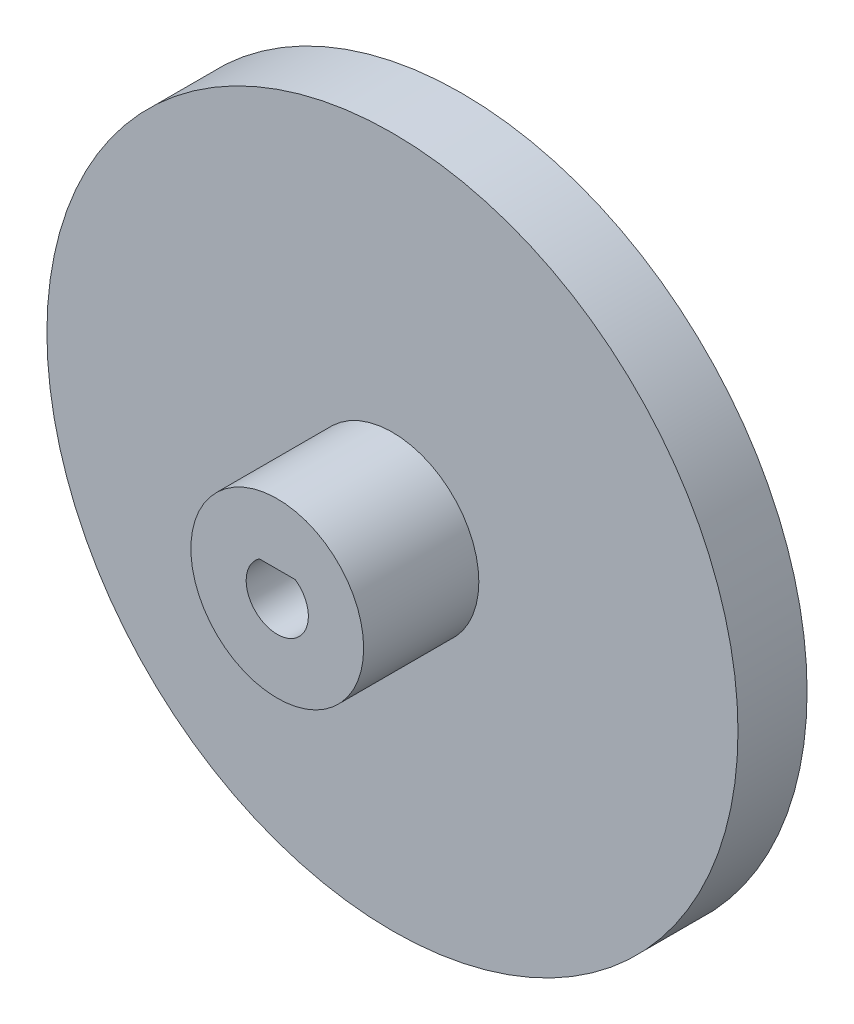
ISO-10303-21;
HEADER;
FILE_DESCRIPTION(('STEP AP214'),'2;1');
FILE_NAME('part.step','',(''),(''),'','','');
FILE_SCHEMA(('AUTOMOTIVE_DESIGN { 1 0 10303 214 1 1 1 1 }'));
ENDSEC;
DATA;
#1=APPLICATION_CONTEXT('core data for automotive mechanical design processes');
#2=APPLICATION_PROTOCOL_DEFINITION('international standard','automotive_design',2000,#1);
#3=PRODUCT_CONTEXT('',#1,'mechanical');
#4=PRODUCT('Part','Part','',(#3));
#5=PRODUCT_RELATED_PRODUCT_CATEGORY('part','',(#4));
#6=PRODUCT_DEFINITION_FORMATION('','',#4);
#7=PRODUCT_DEFINITION_CONTEXT('part definition',#1,'design');
#8=PRODUCT_DEFINITION('design','',#6,#7);
#9=PRODUCT_DEFINITION_SHAPE('','',#8);
#10=(LENGTH_UNIT() NAMED_UNIT(*) SI_UNIT(.MILLI.,.METRE.));
#11=(NAMED_UNIT(*) PLANE_ANGLE_UNIT() SI_UNIT($,.RADIAN.));
#12=(NAMED_UNIT(*) SI_UNIT($,.STERADIAN.) SOLID_ANGLE_UNIT());
#13=UNCERTAINTY_MEASURE_WITH_UNIT(LENGTH_MEASURE(1.E-05),#10,'distance_accuracy_value','');
#14=(GEOMETRIC_REPRESENTATION_CONTEXT(3) GLOBAL_UNCERTAINTY_ASSIGNED_CONTEXT((#13)) GLOBAL_UNIT_ASSIGNED_CONTEXT((#10,
#11,#12)) REPRESENTATION_CONTEXT('',''));
#15=CARTESIAN_POINT('',(0.,0.,0.));
#16=DIRECTION('',(0.,0.,1.));
#17=DIRECTION('',(1.,0.,0.));
#18=AXIS2_PLACEMENT_3D('',#15,#16,#17);
#19=CARTESIAN_POINT('',(0.,0.,-10.));
#20=DIRECTION('',(0.,0.,1.));
#21=DIRECTION('',(1.,0.,0.));
#22=AXIS2_PLACEMENT_3D('',#19,#20,#21);
#23=CYLINDRICAL_SURFACE('',#22,2.7);
#24=DIRECTION('',(0.,0.,1.));
#25=VECTOR('',#24,1.);
#26=CARTESIAN_POINT('',(-1.56524758424985,2.2,-10.));
#27=LINE('',#26,#25);
#28=CARTESIAN_POINT('',(-1.56524758424985,2.2,-10.));
#29=VERTEX_POINT('',#28);
#30=CARTESIAN_POINT('',(-1.56524758424985,2.2,3.));
#31=VERTEX_POINT('',#30);
#32=EDGE_CURVE('E37',#29,#31,#27,.T.);
#33=ORIENTED_EDGE('',*,*,#32,.T.);
#34=CARTESIAN_POINT('',(0.,0.,3.));
#35=DIRECTION('',(0.,0.,1.));
#36=DIRECTION('',(1.,0.,0.));
#37=AXIS2_PLACEMENT_3D('',#34,#35,#36);
#38=CIRCLE('',#37,2.7);
#39=CARTESIAN_POINT('',(1.56524758424985,2.2,3.));
#40=VERTEX_POINT('',#39);
#41=EDGE_CURVE('E129',#40,#31,#38,.F.);
#42=ORIENTED_EDGE('',*,*,#41,.F.);
#43=DIRECTION('',(0.,0.,1.));
#44=VECTOR('',#43,1.);
#45=CARTESIAN_POINT('',(1.56524758424985,2.2,-10.));
#46=LINE('',#45,#44);
#47=CARTESIAN_POINT('',(1.56524758424985,2.2,-10.));
#48=VERTEX_POINT('',#47);
#49=EDGE_CURVE('E42',#48,#40,#46,.T.);
#50=ORIENTED_EDGE('',*,*,#49,.F.);
#51=CARTESIAN_POINT('',(0.,0.,-10.));
#52=DIRECTION('',(0.,0.,1.));
#53=DIRECTION('',(1.,0.,0.));
#54=AXIS2_PLACEMENT_3D('',#51,#52,#53);
#55=CIRCLE('',#54,2.7);
#56=EDGE_CURVE('E162',#29,#48,#55,.T.);
#57=ORIENTED_EDGE('',*,*,#56,.F.);
#58=EDGE_LOOP('',(#33,#42,#50,#57));
#59=FACE_BOUND('',#58,.T.);
#60=ADVANCED_FACE('F34',(#59),#23,.F.);
#61=CARTESIAN_POINT('',(0.,2.2,-10.));
#62=DIRECTION('',(0.,1.,0.));
#63=DIRECTION('',(0.,0.,1.));
#64=AXIS2_PLACEMENT_3D('',#61,#62,#63);
#65=PLANE('',#64);
#66=ORIENTED_EDGE('',*,*,#49,.T.);
#67=DIRECTION('',(1.,0.,0.));
#68=VECTOR('',#67,1.);
#69=CARTESIAN_POINT('',(0.,2.2,3.));
#70=LINE('',#69,#68);
#71=EDGE_CURVE('E132',#31,#40,#70,.T.);
#72=ORIENTED_EDGE('',*,*,#71,.F.);
#73=ORIENTED_EDGE('',*,*,#32,.F.);
#74=DIRECTION('',(-1.,0.,0.));
#75=VECTOR('',#74,1.);
#76=CARTESIAN_POINT('',(0.,2.2,-10.));
#77=LINE('',#76,#75);
#78=EDGE_CURVE('E58',#48,#29,#77,.T.);
#79=ORIENTED_EDGE('',*,*,#78,.F.);
#80=EDGE_LOOP('',(#66,#72,#73,#79));
#81=FACE_BOUND('',#80,.T.);
#82=ADVANCED_FACE('F173',(#81),#65,.F.);
#83=CARTESIAN_POINT('',(0.,0.,-10.));
#84=DIRECTION('',(0.,0.,1.));
#85=DIRECTION('',(1.,0.,0.));
#86=AXIS2_PLACEMENT_3D('',#83,#84,#85);
#87=CYLINDRICAL_SURFACE('',#86,7.5);
#88=CARTESIAN_POINT('',(0.,0.,-10.));
#89=DIRECTION('',(0.,0.,1.));
#90=DIRECTION('',(1.,0.,0.));
#91=AXIS2_PLACEMENT_3D('',#88,#89,#90);
#92=CIRCLE('',#91,7.5);
#93=CARTESIAN_POINT('',(7.5,0.,-10.));
#94=VERTEX_POINT('',#93);
#95=EDGE_CURVE('E165',#94,#94,#92,.T.);
#96=ORIENTED_EDGE('',*,*,#95,.T.);
#97=EDGE_LOOP('',(#96));
#98=FACE_BOUND('',#97,.T.);
#99=CARTESIAN_POINT('',(0.,0.,0.));
#100=DIRECTION('',(0.,0.,1.));
#101=DIRECTION('',(1.,0.,0.));
#102=AXIS2_PLACEMENT_3D('',#99,#100,#101);
#103=CIRCLE('',#102,7.5);
#104=CARTESIAN_POINT('',(7.5,0.,0.));
#105=VERTEX_POINT('',#104);
#106=EDGE_CURVE('E136',#105,#105,#103,.T.);
#107=ORIENTED_EDGE('',*,*,#106,.F.);
#108=EDGE_LOOP('',(#107));
#109=FACE_BOUND('',#108,.T.);
#110=ADVANCED_FACE('F198',(#98,#109),#87,.T.);
#111=CARTESIAN_POINT('',(0.,0.,-10.));
#112=DIRECTION('',(0.,0.,1.));
#113=DIRECTION('',(1.,0.,0.));
#114=AXIS2_PLACEMENT_3D('',#111,#112,#113);
#115=PLANE('',#114);
#116=ORIENTED_EDGE('',*,*,#56,.T.);
#117=ORIENTED_EDGE('',*,*,#78,.T.);
#118=EDGE_LOOP('',(#116,#117));
#119=FACE_BOUND('',#118,.T.);
#120=ORIENTED_EDGE('',*,*,#95,.F.);
#121=EDGE_LOOP('',(#120));
#122=FACE_BOUND('',#121,.T.);
#123=ADVANCED_FACE('F202',(#119,#122),#115,.F.);
#124=CARTESIAN_POINT('',(0.,0.,3.));
#125=DIRECTION('',(0.,0.,-1.));
#126=DIRECTION('',(-1.,0.,0.));
#127=AXIS2_PLACEMENT_3D('',#124,#125,#126);
#128=CYLINDRICAL_SURFACE('',#127,30.);
#129=CARTESIAN_POINT('',(0.,0.,0.));
#130=DIRECTION('',(0.,0.,1.));
#131=DIRECTION('',(1.,0.,0.));
#132=AXIS2_PLACEMENT_3D('',#129,#130,#131);
#133=CIRCLE('',#132,30.);
#134=CARTESIAN_POINT('',(30.,0.,0.));
#135=VERTEX_POINT('',#134);
#136=EDGE_CURVE('E133',#135,#135,#133,.T.);
#137=ORIENTED_EDGE('',*,*,#136,.T.);
#138=EDGE_LOOP('',(#137));
#139=FACE_BOUND('',#138,.T.);
#140=CARTESIAN_POINT('',(0.,0.,6.));
#141=DIRECTION('',(0.,0.,1.));
#142=DIRECTION('',(1.,0.,0.));
#143=AXIS2_PLACEMENT_3D('',#140,#141,#142);
#144=CIRCLE('',#143,30.);
#145=CARTESIAN_POINT('',(30.,0.,6.));
#146=VERTEX_POINT('',#145);
#147=EDGE_CURVE('E84',#146,#146,#144,.T.);
#148=ORIENTED_EDGE('',*,*,#147,.F.);
#149=EDGE_LOOP('',(#148));
#150=FACE_BOUND('',#149,.T.);
#151=ADVANCED_FACE('F208',(#139,#150),#128,.T.);
#152=CARTESIAN_POINT('',(16.9705627484771,16.9705627484771,3.));
#153=DIRECTION('',(0.,0.,-1.));
#154=DIRECTION('',(-1.,0.,0.));
#155=AXIS2_PLACEMENT_3D('',#152,#153,#154);
#156=CYLINDRICAL_SURFACE('',#155,4.25);
#157=CARTESIAN_POINT('',(16.9705627484771,16.9705627484771,3.));
#158=DIRECTION('',(0.,0.,1.));
#159=DIRECTION('',(1.,0.,0.));
#160=AXIS2_PLACEMENT_3D('',#157,#158,#159);
#161=CIRCLE('',#160,4.25);
#162=CARTESIAN_POINT('',(21.2205627484771,16.9705627484771,3.));
#163=VERTEX_POINT('',#162);
#164=EDGE_CURVE('E104',#163,#163,#161,.T.);
#165=ORIENTED_EDGE('',*,*,#164,.T.);
#166=EDGE_LOOP('',(#165));
#167=FACE_BOUND('',#166,.T.);
#168=CARTESIAN_POINT('',(16.9705627484771,16.9705627484771,0.));
#169=DIRECTION('',(0.,0.,1.));
#170=DIRECTION('',(1.,0.,0.));
#171=AXIS2_PLACEMENT_3D('',#168,#169,#170);
#172=CIRCLE('',#171,4.25);
#173=CARTESIAN_POINT('',(21.2205627484771,16.9705627484771,0.));
#174=VERTEX_POINT('',#173);
#175=EDGE_CURVE('E157',#174,#174,#172,.T.);
#176=ORIENTED_EDGE('',*,*,#175,.F.);
#177=EDGE_LOOP('',(#176));
#178=FACE_BOUND('',#177,.T.);
#179=ADVANCED_FACE('F236',(#167,#178),#156,.F.);
#180=CARTESIAN_POINT('',(24.,0.,3.));
#181=DIRECTION('',(0.,0.,-1.));
#182=DIRECTION('',(-1.,0.,0.));
#183=AXIS2_PLACEMENT_3D('',#180,#181,#182);
#184=CYLINDRICAL_SURFACE('',#183,4.25);
#185=CARTESIAN_POINT('',(24.,0.,3.));
#186=DIRECTION('',(0.,0.,1.));
#187=DIRECTION('',(1.,0.,0.));
#188=AXIS2_PLACEMENT_3D('',#185,#186,#187);
#189=CIRCLE('',#188,4.25);
#190=CARTESIAN_POINT('',(28.25,0.,3.));
#191=VERTEX_POINT('',#190);
#192=EDGE_CURVE('E124',#191,#191,#189,.T.);
#193=ORIENTED_EDGE('',*,*,#192,.T.);
#194=EDGE_LOOP('',(#193));
#195=FACE_BOUND('',#194,.T.);
#196=CARTESIAN_POINT('',(24.,0.,0.));
#197=DIRECTION('',(0.,0.,1.));
#198=DIRECTION('',(1.,0.,0.));
#199=AXIS2_PLACEMENT_3D('',#196,#197,#198);
#200=CIRCLE('',#199,4.25);
#201=CARTESIAN_POINT('',(28.25,0.,0.));
#202=VERTEX_POINT('',#201);
#203=EDGE_CURVE('E154',#202,#202,#200,.T.);
#204=ORIENTED_EDGE('',*,*,#203,.F.);
#205=EDGE_LOOP('',(#204));
#206=FACE_BOUND('',#205,.T.);
#207=ADVANCED_FACE('F232',(#195,#206),#184,.F.);
#208=CARTESIAN_POINT('',(16.9705627484771,-16.9705627484771,3.));
#209=DIRECTION('',(0.,0.,-1.));
#210=DIRECTION('',(-1.,0.,0.));
#211=AXIS2_PLACEMENT_3D('',#208,#209,#210);
#212=CYLINDRICAL_SURFACE('',#211,4.25);
#213=CARTESIAN_POINT('',(16.9705627484771,-16.9705627484771,3.));
#214=DIRECTION('',(0.,0.,1.));
#215=DIRECTION('',(1.,0.,0.));
#216=AXIS2_PLACEMENT_3D('',#213,#214,#215);
#217=CIRCLE('',#216,4.25);
#218=CARTESIAN_POINT('',(21.2205627484771,-16.9705627484771,3.));
#219=VERTEX_POINT('',#218);
#220=EDGE_CURVE('E121',#219,#219,#217,.T.);
#221=ORIENTED_EDGE('',*,*,#220,.T.);
#222=EDGE_LOOP('',(#221));
#223=FACE_BOUND('',#222,.T.);
#224=CARTESIAN_POINT('',(16.9705627484771,-16.9705627484771,0.));
#225=DIRECTION('',(0.,0.,1.));
#226=DIRECTION('',(1.,0.,0.));
#227=AXIS2_PLACEMENT_3D('',#224,#225,#226);
#228=CIRCLE('',#227,4.25);
#229=CARTESIAN_POINT('',(21.2205627484771,-16.9705627484771,0.));
#230=VERTEX_POINT('',#229);
#231=EDGE_CURVE('E151',#230,#230,#228,.T.);
#232=ORIENTED_EDGE('',*,*,#231,.F.);
#233=EDGE_LOOP('',(#232));
#234=FACE_BOUND('',#233,.T.);
#235=ADVANCED_FACE('F228',(#223,#234),#212,.F.);
#236=CARTESIAN_POINT('',(0.,-24.,3.));
#237=DIRECTION('',(0.,0.,-1.));
#238=DIRECTION('',(-1.,0.,0.));
#239=AXIS2_PLACEMENT_3D('',#236,#237,#238);
#240=CYLINDRICAL_SURFACE('',#239,4.25);
#241=CARTESIAN_POINT('',(0.,-24.,3.));
#242=DIRECTION('',(0.,0.,1.));
#243=DIRECTION('',(1.,0.,0.));
#244=AXIS2_PLACEMENT_3D('',#241,#242,#243);
#245=CIRCLE('',#244,4.25);
#246=CARTESIAN_POINT('',(4.25,-24.,3.));
#247=VERTEX_POINT('',#246);
#248=EDGE_CURVE('E118',#247,#247,#245,.T.);
#249=ORIENTED_EDGE('',*,*,#248,.T.);
#250=EDGE_LOOP('',(#249));
#251=FACE_BOUND('',#250,.T.);
#252=CARTESIAN_POINT('',(0.,-24.,0.));
#253=DIRECTION('',(0.,0.,1.));
#254=DIRECTION('',(1.,0.,0.));
#255=AXIS2_PLACEMENT_3D('',#252,#253,#254);
#256=CIRCLE('',#255,4.25);
#257=CARTESIAN_POINT('',(4.25,-24.,0.));
#258=VERTEX_POINT('',#257);
#259=EDGE_CURVE('E148',#258,#258,#256,.T.);
#260=ORIENTED_EDGE('',*,*,#259,.F.);
#261=EDGE_LOOP('',(#260));
#262=FACE_BOUND('',#261,.T.);
#263=ADVANCED_FACE('F224',(#251,#262),#240,.F.);
#264=CARTESIAN_POINT('',(-16.9705627484771,-16.9705627484771,3.));
#265=DIRECTION('',(0.,0.,-1.));
#266=DIRECTION('',(-1.,0.,0.));
#267=AXIS2_PLACEMENT_3D('',#264,#265,#266);
#268=CYLINDRICAL_SURFACE('',#267,4.25);
#269=CARTESIAN_POINT('',(-16.9705627484771,-16.9705627484771,3.));
#270=DIRECTION('',(0.,0.,1.));
#271=DIRECTION('',(1.,0.,0.));
#272=AXIS2_PLACEMENT_3D('',#269,#270,#271);
#273=CIRCLE('',#272,4.25);
#274=CARTESIAN_POINT('',(-12.7205627484771,-16.9705627484771,3.));
#275=VERTEX_POINT('',#274);
#276=EDGE_CURVE('E115',#275,#275,#273,.T.);
#277=ORIENTED_EDGE('',*,*,#276,.T.);
#278=EDGE_LOOP('',(#277));
#279=FACE_BOUND('',#278,.T.);
#280=CARTESIAN_POINT('',(-16.9705627484771,-16.9705627484771,0.));
#281=DIRECTION('',(0.,0.,1.));
#282=DIRECTION('',(1.,0.,0.));
#283=AXIS2_PLACEMENT_3D('',#280,#281,#282);
#284=CIRCLE('',#283,4.25);
#285=CARTESIAN_POINT('',(-12.7205627484771,-16.9705627484771,0.));
#286=VERTEX_POINT('',#285);
#287=EDGE_CURVE('E145',#286,#286,#284,.T.);
#288=ORIENTED_EDGE('',*,*,#287,.F.);
#289=EDGE_LOOP('',(#288));
#290=FACE_BOUND('',#289,.T.);
#291=ADVANCED_FACE('F220',(#279,#290),#268,.F.);
#292=CARTESIAN_POINT('',(-24.,0.,3.));
#293=DIRECTION('',(0.,0.,-1.));
#294=DIRECTION('',(-1.,0.,0.));
#295=AXIS2_PLACEMENT_3D('',#292,#293,#294);
#296=CYLINDRICAL_SURFACE('',#295,4.25);
#297=CARTESIAN_POINT('',(-24.,0.,3.));
#298=DIRECTION('',(0.,0.,1.));
#299=DIRECTION('',(1.,0.,0.));
#300=AXIS2_PLACEMENT_3D('',#297,#298,#299);
#301=CIRCLE('',#300,4.25);
#302=CARTESIAN_POINT('',(-19.75,0.,3.));
#303=VERTEX_POINT('',#302);
#304=EDGE_CURVE('E112',#303,#303,#301,.T.);
#305=ORIENTED_EDGE('',*,*,#304,.T.);
#306=EDGE_LOOP('',(#305));
#307=FACE_BOUND('',#306,.T.);
#308=CARTESIAN_POINT('',(-24.,0.,0.));
#309=DIRECTION('',(0.,0.,1.));
#310=DIRECTION('',(1.,0.,0.));
#311=AXIS2_PLACEMENT_3D('',#308,#309,#310);
#312=CIRCLE('',#311,4.25);
#313=CARTESIAN_POINT('',(-19.75,0.,0.));
#314=VERTEX_POINT('',#313);
#315=EDGE_CURVE('E142',#314,#314,#312,.T.);
#316=ORIENTED_EDGE('',*,*,#315,.F.);
#317=EDGE_LOOP('',(#316));
#318=FACE_BOUND('',#317,.T.);
#319=ADVANCED_FACE('F216',(#307,#318),#296,.F.);
#320=CARTESIAN_POINT('',(-16.9705627484771,16.9705627484771,3.));
#321=DIRECTION('',(0.,0.,-1.));
#322=DIRECTION('',(-1.,0.,0.));
#323=AXIS2_PLACEMENT_3D('',#320,#321,#322);
#324=CYLINDRICAL_SURFACE('',#323,4.25);
#325=CARTESIAN_POINT('',(-16.9705627484771,16.9705627484771,3.));
#326=DIRECTION('',(0.,0.,1.));
#327=DIRECTION('',(1.,0.,0.));
#328=AXIS2_PLACEMENT_3D('',#325,#326,#327);
#329=CIRCLE('',#328,4.25);
#330=CARTESIAN_POINT('',(-12.7205627484771,16.9705627484771,3.));
#331=VERTEX_POINT('',#330);
#332=EDGE_CURVE('E109',#331,#331,#329,.T.);
#333=ORIENTED_EDGE('',*,*,#332,.T.);
#334=EDGE_LOOP('',(#333));
#335=FACE_BOUND('',#334,.T.);
#336=CARTESIAN_POINT('',(-16.9705627484771,16.9705627484771,0.));
#337=DIRECTION('',(0.,0.,1.));
#338=DIRECTION('',(1.,0.,0.));
#339=AXIS2_PLACEMENT_3D('',#336,#337,#338);
#340=CIRCLE('',#339,4.25);
#341=CARTESIAN_POINT('',(-12.7205627484771,16.9705627484771,0.));
#342=VERTEX_POINT('',#341);
#343=EDGE_CURVE('E139',#342,#342,#340,.T.);
#344=ORIENTED_EDGE('',*,*,#343,.F.);
#345=EDGE_LOOP('',(#344));
#346=FACE_BOUND('',#345,.T.);
#347=ADVANCED_FACE('F212',(#335,#346),#324,.F.);
#348=CARTESIAN_POINT('',(0.,24.,3.));
#349=DIRECTION('',(0.,0.,-1.));
#350=DIRECTION('',(-1.,0.,0.));
#351=AXIS2_PLACEMENT_3D('',#348,#349,#350);
#352=CYLINDRICAL_SURFACE('',#351,4.25);
#353=CARTESIAN_POINT('',(0.,24.,3.));
#354=DIRECTION('',(0.,0.,1.));
#355=DIRECTION('',(1.,0.,0.));
#356=AXIS2_PLACEMENT_3D('',#353,#354,#355);
#357=CIRCLE('',#356,4.25);
#358=CARTESIAN_POINT('',(4.25,24.,3.));
#359=VERTEX_POINT('',#358);
#360=EDGE_CURVE('E105',#359,#359,#357,.T.);
#361=ORIENTED_EDGE('',*,*,#360,.T.);
#362=EDGE_LOOP('',(#361));
#363=FACE_BOUND('',#362,.T.);
#364=CARTESIAN_POINT('',(0.,24.,0.));
#365=DIRECTION('',(0.,0.,1.));
#366=DIRECTION('',(1.,0.,0.));
#367=AXIS2_PLACEMENT_3D('',#364,#365,#366);
#368=CIRCLE('',#367,4.25);
#369=CARTESIAN_POINT('',(4.25,24.,0.));
#370=VERTEX_POINT('',#369);
#371=EDGE_CURVE('E108',#370,#370,#368,.T.);
#372=ORIENTED_EDGE('',*,*,#371,.F.);
#373=EDGE_LOOP('',(#372));
#374=FACE_BOUND('',#373,.T.);
#375=ADVANCED_FACE('F187',(#363,#374),#352,.F.);
#376=CARTESIAN_POINT('',(0.,0.,0.));
#377=DIRECTION('',(0.,0.,1.));
#378=DIRECTION('',(1.,0.,0.));
#379=AXIS2_PLACEMENT_3D('',#376,#377,#378);
#380=PLANE('',#379);
#381=ORIENTED_EDGE('',*,*,#106,.T.);
#382=EDGE_LOOP('',(#381));
#383=FACE_BOUND('',#382,.T.);
#384=ORIENTED_EDGE('',*,*,#371,.T.);
#385=EDGE_LOOP('',(#384));
#386=FACE_BOUND('',#385,.T.);
#387=ORIENTED_EDGE('',*,*,#343,.T.);
#388=EDGE_LOOP('',(#387));
#389=FACE_BOUND('',#388,.T.);
#390=ORIENTED_EDGE('',*,*,#315,.T.);
#391=EDGE_LOOP('',(#390));
#392=FACE_BOUND('',#391,.T.);
#393=ORIENTED_EDGE('',*,*,#287,.T.);
#394=EDGE_LOOP('',(#393));
#395=FACE_BOUND('',#394,.T.);
#396=ORIENTED_EDGE('',*,*,#259,.T.);
#397=EDGE_LOOP('',(#396));
#398=FACE_BOUND('',#397,.T.);
#399=ORIENTED_EDGE('',*,*,#231,.T.);
#400=EDGE_LOOP('',(#399));
#401=FACE_BOUND('',#400,.T.);
#402=ORIENTED_EDGE('',*,*,#203,.T.);
#403=EDGE_LOOP('',(#402));
#404=FACE_BOUND('',#403,.T.);
#405=ORIENTED_EDGE('',*,*,#175,.T.);
#406=EDGE_LOOP('',(#405));
#407=FACE_BOUND('',#406,.T.);
#408=ORIENTED_EDGE('',*,*,#136,.F.);
#409=EDGE_LOOP('',(#408));
#410=FACE_BOUND('',#409,.T.);
#411=ADVANCED_FACE('F178',(#383,#386,#389,#392,#395,#398,#401,#404,#407,#410),#380,.F.);
#412=CARTESIAN_POINT('',(0.,0.,3.));
#413=DIRECTION('',(0.,0.,1.));
#414=DIRECTION('',(1.,0.,0.));
#415=AXIS2_PLACEMENT_3D('',#412,#413,#414);
#416=PLANE('',#415);
#417=ORIENTED_EDGE('',*,*,#71,.T.);
#418=ORIENTED_EDGE('',*,*,#41,.T.);
#419=EDGE_LOOP('',(#417,#418));
#420=FACE_BOUND('',#419,.T.);
#421=ADVANCED_FACE('F175',(#420),#416,.F.);
#422=ORIENTED_EDGE('',*,*,#164,.F.);
#423=EDGE_LOOP('',(#422));
#424=FACE_BOUND('',#423,.T.);
#425=ADVANCED_FACE('F177',(#424),#416,.F.);
#426=ORIENTED_EDGE('',*,*,#192,.F.);
#427=EDGE_LOOP('',(#426));
#428=FACE_BOUND('',#427,.T.);
#429=ADVANCED_FACE('F180',(#428),#416,.F.);
#430=ORIENTED_EDGE('',*,*,#220,.F.);
#431=EDGE_LOOP('',(#430));
#432=FACE_BOUND('',#431,.T.);
#433=ADVANCED_FACE('F192',(#432),#416,.F.);
#434=ORIENTED_EDGE('',*,*,#248,.F.);
#435=EDGE_LOOP('',(#434));
#436=FACE_BOUND('',#435,.T.);
#437=ADVANCED_FACE('F334',(#436),#416,.F.);
#438=ORIENTED_EDGE('',*,*,#276,.F.);
#439=EDGE_LOOP('',(#438));
#440=FACE_BOUND('',#439,.T.);
#441=ADVANCED_FACE('F325',(#440),#416,.F.);
#442=ORIENTED_EDGE('',*,*,#304,.F.);
#443=EDGE_LOOP('',(#442));
#444=FACE_BOUND('',#443,.T.);
#445=ADVANCED_FACE('F316',(#444),#416,.F.);
#446=ORIENTED_EDGE('',*,*,#332,.F.);
#447=EDGE_LOOP('',(#446));
#448=FACE_BOUND('',#447,.T.);
#449=ADVANCED_FACE('F258',(#448),#416,.F.);
#450=ORIENTED_EDGE('',*,*,#360,.F.);
#451=EDGE_LOOP('',(#450));
#452=FACE_BOUND('',#451,.T.);
#453=ADVANCED_FACE('F186',(#452),#416,.F.);
#454=CARTESIAN_POINT('',(0.,0.,6.));
#455=DIRECTION('',(0.,0.,1.));
#456=DIRECTION('',(1.,0.,0.));
#457=AXIS2_PLACEMENT_3D('',#454,#455,#456);
#458=PLANE('',#457);
#459=CARTESIAN_POINT('',(0.,0.,6.));
#460=DIRECTION('',(0.,0.,1.));
#461=DIRECTION('',(1.,0.,0.));
#462=AXIS2_PLACEMENT_3D('',#459,#460,#461);
#463=CIRCLE('',#462,7.5);
#464=CARTESIAN_POINT('',(7.5,0.,6.));
#465=VERTEX_POINT('',#464);
#466=EDGE_CURVE('E11',#465,#465,#463,.T.);
#467=ORIENTED_EDGE('',*,*,#466,.F.);
#468=EDGE_LOOP('',(#467));
#469=FACE_BOUND('',#468,.T.);
#470=ORIENTED_EDGE('',*,*,#147,.T.);
#471=EDGE_LOOP('',(#470));
#472=FACE_BOUND('',#471,.T.);
#473=ADVANCED_FACE('F249',(#469,#472),#458,.T.);
#474=CARTESIAN_POINT('',(0.,0.,16.));
#475=DIRECTION('',(0.,0.,-1.));
#476=DIRECTION('',(-1.,0.,0.));
#477=AXIS2_PLACEMENT_3D('',#474,#475,#476);
#478=CYLINDRICAL_SURFACE('',#477,2.7);
#479=CARTESIAN_POINT('',(0.,0.,6.));
#480=DIRECTION('',(0.,0.,1.));
#481=DIRECTION('',(1.,0.,0.));
#482=AXIS2_PLACEMENT_3D('',#479,#480,#481);
#483=CIRCLE('',#482,2.7);
#484=CARTESIAN_POINT('',(-1.56524758424985,2.2,6.));
#485=VERTEX_POINT('',#484);
#486=CARTESIAN_POINT('',(1.56524758424985,2.2,6.));
#487=VERTEX_POINT('',#486);
#488=EDGE_CURVE('E50',#485,#487,#483,.T.);
#489=ORIENTED_EDGE('',*,*,#488,.F.);
#490=DIRECTION('',(0.,0.,-1.));
#491=VECTOR('',#490,1.);
#492=CARTESIAN_POINT('',(-1.56524758424985,2.2,16.));
#493=LINE('',#492,#491);
#494=CARTESIAN_POINT('',(-1.56524758424985,2.2,16.));
#495=VERTEX_POINT('',#494);
#496=EDGE_CURVE('E75',#495,#485,#493,.T.);
#497=ORIENTED_EDGE('',*,*,#496,.F.);
#498=CARTESIAN_POINT('',(0.,0.,16.));
#499=DIRECTION('',(0.,0.,1.));
#500=DIRECTION('',(1.,0.,0.));
#501=AXIS2_PLACEMENT_3D('',#498,#499,#500);
#502=CIRCLE('',#501,2.7);
#503=CARTESIAN_POINT('',(1.56524758424985,2.2,16.));
#504=VERTEX_POINT('',#503);
#505=EDGE_CURVE('E78',#495,#504,#502,.T.);
#506=ORIENTED_EDGE('',*,*,#505,.T.);
#507=DIRECTION('',(0.,0.,-1.));
#508=VECTOR('',#507,1.);
#509=CARTESIAN_POINT('',(1.56524758424985,2.2,16.));
#510=LINE('',#509,#508);
#511=EDGE_CURVE('E85',#504,#487,#510,.T.);
#512=ORIENTED_EDGE('',*,*,#511,.T.);
#513=EDGE_LOOP('',(#489,#497,#506,#512));
#514=FACE_BOUND('',#513,.T.);
#515=ADVANCED_FACE('F77',(#514),#478,.F.);
#516=CARTESIAN_POINT('',(0.,2.2,16.));
#517=DIRECTION('',(0.,-1.,0.));
#518=DIRECTION('',(0.,0.,-1.));
#519=AXIS2_PLACEMENT_3D('',#516,#517,#518);
#520=PLANE('',#519);
#521=DIRECTION('',(-1.,0.,0.));
#522=VECTOR('',#521,1.);
#523=CARTESIAN_POINT('',(0.,2.2,6.));
#524=LINE('',#523,#522);
#525=EDGE_CURVE('E91',#487,#485,#524,.T.);
#526=ORIENTED_EDGE('',*,*,#525,.F.);
#527=ORIENTED_EDGE('',*,*,#511,.F.);
#528=DIRECTION('',(-1.,0.,0.));
#529=VECTOR('',#528,1.);
#530=CARTESIAN_POINT('',(0.,2.2,16.));
#531=LINE('',#530,#529);
#532=EDGE_CURVE('E90',#504,#495,#531,.T.);
#533=ORIENTED_EDGE('',*,*,#532,.T.);
#534=ORIENTED_EDGE('',*,*,#496,.T.);
#535=EDGE_LOOP('',(#526,#527,#533,#534));
#536=FACE_BOUND('',#535,.T.);
#537=ADVANCED_FACE('F93',(#536),#520,.T.);
#538=CARTESIAN_POINT('',(0.,0.,16.));
#539=DIRECTION('',(0.,0.,-1.));
#540=DIRECTION('',(-1.,0.,0.));
#541=AXIS2_PLACEMENT_3D('',#538,#539,#540);
#542=CYLINDRICAL_SURFACE('',#541,7.5);
#543=CARTESIAN_POINT('',(0.,0.,16.));
#544=DIRECTION('',(0.,0.,1.));
#545=DIRECTION('',(1.,0.,0.));
#546=AXIS2_PLACEMENT_3D('',#543,#544,#545);
#547=CIRCLE('',#546,7.5);
#548=CARTESIAN_POINT('',(7.5,0.,16.));
#549=VERTEX_POINT('',#548);
#550=EDGE_CURVE('E94',#549,#549,#547,.T.);
#551=ORIENTED_EDGE('',*,*,#550,.F.);
#552=EDGE_LOOP('',(#551));
#553=FACE_BOUND('',#552,.T.);
#554=ORIENTED_EDGE('',*,*,#466,.T.);
#555=EDGE_LOOP('',(#554));
#556=FACE_BOUND('',#555,.T.);
#557=ADVANCED_FACE('F266',(#553,#556),#542,.T.);
#558=CARTESIAN_POINT('',(0.,0.,16.));
#559=DIRECTION('',(0.,0.,1.));
#560=DIRECTION('',(1.,0.,0.));
#561=AXIS2_PLACEMENT_3D('',#558,#559,#560);
#562=PLANE('',#561);
#563=ORIENTED_EDGE('',*,*,#505,.F.);
#564=ORIENTED_EDGE('',*,*,#532,.F.);
#565=EDGE_LOOP('',(#563,#564));
#566=FACE_BOUND('',#565,.T.);
#567=ORIENTED_EDGE('',*,*,#550,.T.);
#568=EDGE_LOOP('',(#567));
#569=FACE_BOUND('',#568,.T.);
#570=ADVANCED_FACE('F88',(#566,#569),#562,.T.);
#571=ORIENTED_EDGE('',*,*,#525,.T.);
#572=ORIENTED_EDGE('',*,*,#488,.T.);
#573=EDGE_LOOP('',(#571,#572));
#574=FACE_BOUND('',#573,.T.);
#575=ADVANCED_FACE('F252',(#574),#458,.T.);
#576=CLOSED_SHELL('',(#60,#82,#110,#123,#151,#179,#207,#235,#263,#291,#319,#347,#375,#411,#421,
#425,#429,#433,#437,#441,#445,#449,#453,#473,#515,#537,#557,#570,#575));
#577=MANIFOLD_SOLID_BREP('B2',#576);
#578=ADVANCED_BREP_SHAPE_REPRESENTATION('',(#18,#577),#14);
#579=SHAPE_DEFINITION_REPRESENTATION(#9,#578);
ENDSEC;
END-ISO-10303-21;
